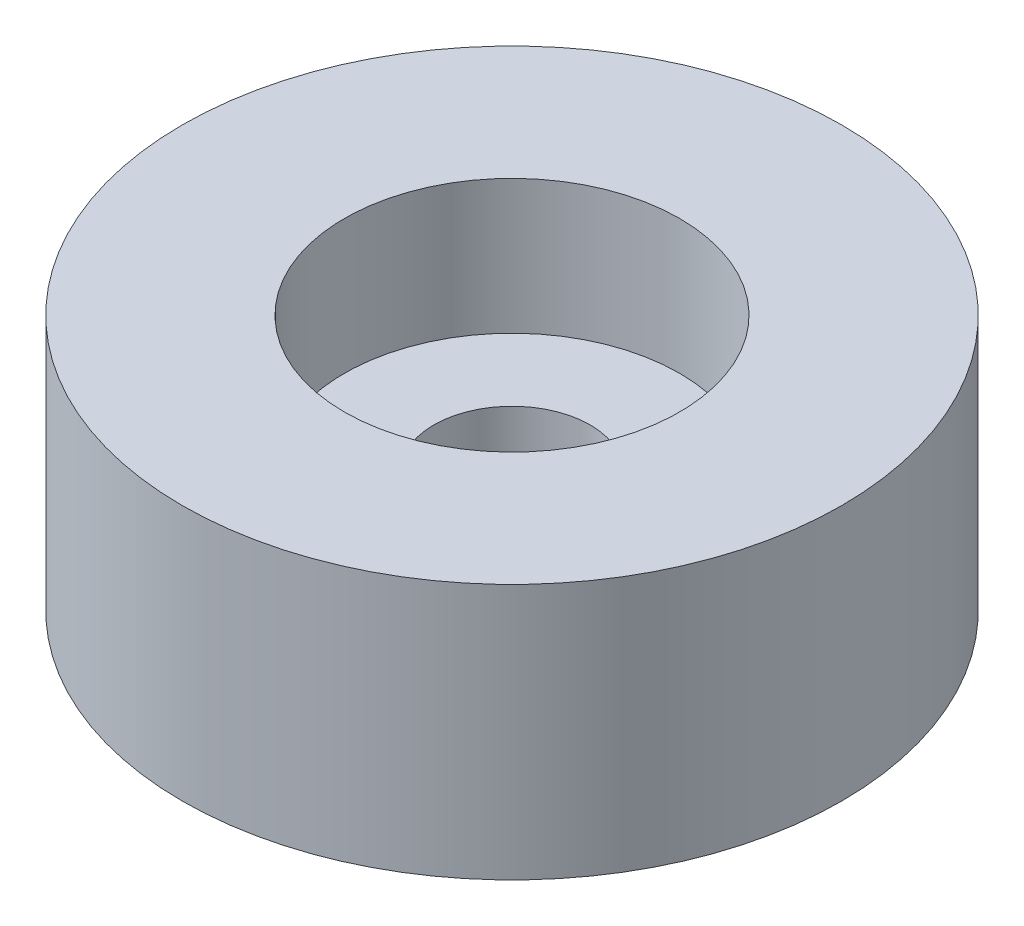
ISO-10303-21;
HEADER;
FILE_DESCRIPTION(('STEP AP214'),'2;1');
FILE_NAME('part.step','',(''),(''),'','','');
FILE_SCHEMA(('AUTOMOTIVE_DESIGN { 1 0 10303 214 1 1 1 1 }'));
ENDSEC;
DATA;
#1=APPLICATION_CONTEXT('core data for automotive mechanical design processes');
#2=APPLICATION_PROTOCOL_DEFINITION('international standard','automotive_design',2000,#1);
#3=PRODUCT_CONTEXT('',#1,'mechanical');
#4=PRODUCT('Part','Part','',(#3));
#5=PRODUCT_RELATED_PRODUCT_CATEGORY('part','',(#4));
#6=PRODUCT_DEFINITION_FORMATION('','',#4);
#7=PRODUCT_DEFINITION_CONTEXT('part definition',#1,'design');
#8=PRODUCT_DEFINITION('design','',#6,#7);
#9=PRODUCT_DEFINITION_SHAPE('','',#8);
#10=(LENGTH_UNIT() NAMED_UNIT(*) SI_UNIT(.MILLI.,.METRE.));
#11=(NAMED_UNIT(*) PLANE_ANGLE_UNIT() SI_UNIT($,.RADIAN.));
#12=(NAMED_UNIT(*) SI_UNIT($,.STERADIAN.) SOLID_ANGLE_UNIT());
#13=UNCERTAINTY_MEASURE_WITH_UNIT(LENGTH_MEASURE(1.E-05),#10,'distance_accuracy_value','');
#14=(GEOMETRIC_REPRESENTATION_CONTEXT(3) GLOBAL_UNCERTAINTY_ASSIGNED_CONTEXT((#13)) GLOBAL_UNIT_ASSIGNED_CONTEXT((#10,
#11,#12)) REPRESENTATION_CONTEXT('',''));
#15=CARTESIAN_POINT('',(0.,0.,0.));
#16=DIRECTION('',(0.,0.,1.));
#17=DIRECTION('',(1.,0.,0.));
#18=AXIS2_PLACEMENT_3D('',#15,#16,#17);
#19=CARTESIAN_POINT('',(0.,11.,0.));
#20=DIRECTION('',(0.,-1.,0.));
#21=DIRECTION('',(0.,0.,-1.));
#22=AXIS2_PLACEMENT_3D('',#19,#20,#21);
#23=CYLINDRICAL_SURFACE('',#22,7.);
#24=CARTESIAN_POINT('',(0.,3.,0.));
#25=DIRECTION('',(0.,-1.,0.));
#26=DIRECTION('',(0.,0.,-1.));
#27=AXIS2_PLACEMENT_3D('',#24,#25,#26);
#28=CIRCLE('',#27,7.);
#29=CARTESIAN_POINT('',(0.,3.,-7.));
#30=VERTEX_POINT('',#29);
#31=EDGE_CURVE('E137',#30,#30,#28,.T.);
#32=ORIENTED_EDGE('',*,*,#31,.T.);
#33=EDGE_LOOP('',(#32));
#34=FACE_BOUND('',#33,.T.);
#35=CARTESIAN_POINT('',(0.,10.9,0.));
#36=DIRECTION('',(0.,1.,0.));
#37=DIRECTION('',(0.,0.,1.));
#38=AXIS2_PLACEMENT_3D('',#35,#36,#37);
#39=CIRCLE('',#38,7.);
#40=CARTESIAN_POINT('',(0.,10.9,7.));
#41=VERTEX_POINT('',#40);
#42=EDGE_CURVE('E37',#41,#41,#39,.F.);
#43=ORIENTED_EDGE('',*,*,#42,.F.);
#44=EDGE_LOOP('',(#43));
#45=FACE_BOUND('',#44,.T.);
#46=ADVANCED_FACE('F33',(#34,#45),#23,.F.);
#47=CARTESIAN_POINT('',(0.,22.9,0.));
#48=DIRECTION('',(0.,-1.,0.));
#49=DIRECTION('',(0.,0.,-1.));
#50=AXIS2_PLACEMENT_3D('',#47,#48,#49);
#51=CYLINDRICAL_SURFACE('',#50,29.5);
#52=CARTESIAN_POINT('',(0.,22.9,0.));
#53=DIRECTION('',(0.,1.,0.));
#54=DIRECTION('',(0.,0.,1.));
#55=AXIS2_PLACEMENT_3D('',#52,#53,#54);
#56=CIRCLE('',#55,29.5);
#57=CARTESIAN_POINT('',(0.,22.9,29.5));
#58=VERTEX_POINT('',#57);
#59=EDGE_CURVE('E11',#58,#58,#56,.T.);
#60=ORIENTED_EDGE('',*,*,#59,.F.);
#61=EDGE_LOOP('',(#60));
#62=FACE_BOUND('',#61,.T.);
#63=CARTESIAN_POINT('',(0.,0.,0.));
#64=DIRECTION('',(0.,1.,0.));
#65=DIRECTION('',(0.,0.,1.));
#66=AXIS2_PLACEMENT_3D('',#63,#64,#65);
#67=CIRCLE('',#66,29.5);
#68=CARTESIAN_POINT('',(0.,0.,29.5));
#69=VERTEX_POINT('',#68);
#70=EDGE_CURVE('E42',#69,#69,#67,.T.);
#71=ORIENTED_EDGE('',*,*,#70,.T.);
#72=EDGE_LOOP('',(#71));
#73=FACE_BOUND('',#72,.T.);
#74=ADVANCED_FACE('F35',(#62,#73),#51,.T.);
#75=CARTESIAN_POINT('',(0.,22.9,0.));
#76=DIRECTION('',(0.,1.,0.));
#77=DIRECTION('',(0.,0.,1.));
#78=AXIS2_PLACEMENT_3D('',#75,#76,#77);
#79=PLANE('',#78);
#80=CARTESIAN_POINT('',(0.,22.9,0.));
#81=DIRECTION('',(0.,1.,0.));
#82=DIRECTION('',(0.,0.,1.));
#83=AXIS2_PLACEMENT_3D('',#80,#81,#82);
#84=CIRCLE('',#83,15.);
#85=CARTESIAN_POINT('',(0.,22.9,15.));
#86=VERTEX_POINT('',#85);
#87=EDGE_CURVE('E239',#86,#86,#84,.T.);
#88=ORIENTED_EDGE('',*,*,#87,.F.);
#89=EDGE_LOOP('',(#88));
#90=FACE_BOUND('',#89,.T.);
#91=ORIENTED_EDGE('',*,*,#59,.T.);
#92=EDGE_LOOP('',(#91));
#93=FACE_BOUND('',#92,.T.);
#94=ADVANCED_FACE('F171',(#90,#93),#79,.T.);
#95=CARTESIAN_POINT('',(0.,0.,0.));
#96=DIRECTION('',(0.,1.,0.));
#97=DIRECTION('',(0.,0.,1.));
#98=AXIS2_PLACEMENT_3D('',#95,#96,#97);
#99=PLANE('',#98);
#100=DIRECTION('',(-0.923879532511261,0.,0.382683432365151));
#101=VECTOR('',#100,1.);
#102=CARTESIAN_POINT('',(12.2458698356837,0.,12.245869835682));
#103=LINE('',#102,#101);
#104=CARTESIAN_POINT('',(12.2458698356837,0.,12.245869835682));
#105=VERTEX_POINT('',#104);
#106=CARTESIAN_POINT('',(1.15269990466416E-12,0.,17.3182752046782));
#107=VERTEX_POINT('',#106);
#108=EDGE_CURVE('E136',#105,#107,#103,.T.);
#109=ORIENTED_EDGE('',*,*,#108,.F.);
#110=DIRECTION('',(-0.382683432365028,0.,0.923879532511312));
#111=VECTOR('',#110,1.);
#112=CARTESIAN_POINT('',(17.3182752046782,0.,-1.15130762922161E-12));
#113=LINE('',#112,#111);
#114=CARTESIAN_POINT('',(17.3182752046782,0.,-1.15130762922161E-12));
#115=VERTEX_POINT('',#114);
#116=EDGE_CURVE('E50',#115,#105,#113,.T.);
#117=ORIENTED_EDGE('',*,*,#116,.F.);
#118=DIRECTION('',(0.382683432365151,0.,0.923879532511261));
#119=VECTOR('',#118,1.);
#120=CARTESIAN_POINT('',(12.245869835682,0.,-12.2458698356836));
#121=LINE('',#120,#119);
#122=CARTESIAN_POINT('',(12.245869835682,0.,-12.2458698356836));
#123=VERTEX_POINT('',#122);
#124=EDGE_CURVE('E152',#123,#115,#121,.T.);
#125=ORIENTED_EDGE('',*,*,#124,.F.);
#126=DIRECTION('',(0.923879532511312,0.,0.382683432365028));
#127=VECTOR('',#126,1.);
#128=CARTESIAN_POINT('',(-1.15558552231308E-12,0.,-17.3182752046782));
#129=LINE('',#128,#127);
#130=CARTESIAN_POINT('',(-1.15558552231308E-12,0.,-17.3182752046782));
#131=VERTEX_POINT('',#130);
#132=EDGE_CURVE('E150',#131,#123,#129,.T.);
#133=ORIENTED_EDGE('',*,*,#132,.F.);
#134=DIRECTION('',(0.923879532511261,0.,-0.382683432365151));
#135=VECTOR('',#134,1.);
#136=CARTESIAN_POINT('',(-12.2458698356836,0.,-12.245869835682));
#137=LINE('',#136,#135);
#138=CARTESIAN_POINT('',(-12.2458698356836,0.,-12.245869835682));
#139=VERTEX_POINT('',#138);
#140=EDGE_CURVE('E110',#139,#131,#137,.T.);
#141=ORIENTED_EDGE('',*,*,#140,.F.);
#142=DIRECTION('',(0.382683432365028,0.,-0.923879532511312));
#143=VECTOR('',#142,1.);
#144=CARTESIAN_POINT('',(-17.3182752046782,0.,1.14838694109665E-12));
#145=LINE('',#144,#143);
#146=CARTESIAN_POINT('',(-17.3182752046782,0.,1.14838694109665E-12));
#147=VERTEX_POINT('',#146);
#148=EDGE_CURVE('E146',#147,#139,#145,.T.);
#149=ORIENTED_EDGE('',*,*,#148,.F.);
#150=DIRECTION('',(-0.382683432365151,0.,-0.923879532511261));
#151=VECTOR('',#150,1.);
#152=CARTESIAN_POINT('',(-12.245869835682,0.,12.2458698356836));
#153=LINE('',#152,#151);
#154=CARTESIAN_POINT('',(-12.245869835682,0.,12.2458698356836));
#155=VERTEX_POINT('',#154);
#156=EDGE_CURVE('E143',#155,#147,#153,.T.);
#157=ORIENTED_EDGE('',*,*,#156,.F.);
#158=DIRECTION('',(-0.923879532511312,0.,-0.382683432365028));
#159=VECTOR('',#158,1.);
#160=CARTESIAN_POINT('',(1.15269990466416E-12,0.,17.3182752046782));
#161=LINE('',#160,#159);
#162=EDGE_CURVE('E140',#107,#155,#161,.T.);
#163=ORIENTED_EDGE('',*,*,#162,.F.);
#164=EDGE_LOOP('',(#109,#117,#125,#133,#141,#149,#157,#163));
#165=FACE_BOUND('',#164,.T.);
#166=ORIENTED_EDGE('',*,*,#70,.F.);
#167=EDGE_LOOP('',(#166));
#168=FACE_BOUND('',#167,.T.);
#169=ADVANCED_FACE('F168',(#165,#168),#99,.F.);
#170=CARTESIAN_POINT('',(17.3182752046782,3.,-1.15130762922161E-12));
#171=DIRECTION('',(0.923879532511312,0.,0.382683432365028));
#172=DIRECTION('',(0.382683432365028,0.,-0.923879532511312));
#173=AXIS2_PLACEMENT_3D('',#170,#171,#172);
#174=PLANE('',#173);
#175=ORIENTED_EDGE('',*,*,#116,.T.);
#176=DIRECTION('',(0.,-1.,0.));
#177=VECTOR('',#176,1.);
#178=CARTESIAN_POINT('',(12.2458698356837,3.,12.245869835682));
#179=LINE('',#178,#177);
#180=CARTESIAN_POINT('',(12.2458698356837,3.,12.245869835682));
#181=VERTEX_POINT('',#180);
#182=EDGE_CURVE('E86',#181,#105,#179,.T.);
#183=ORIENTED_EDGE('',*,*,#182,.F.);
#184=DIRECTION('',(-0.382683432365028,0.,0.923879532511312));
#185=VECTOR('',#184,1.);
#186=CARTESIAN_POINT('',(17.3182752046782,3.,-1.15130762922161E-12));
#187=LINE('',#186,#185);
#188=CARTESIAN_POINT('',(17.3182752046782,3.,-1.15130762922161E-12));
#189=VERTEX_POINT('',#188);
#190=EDGE_CURVE('E154',#189,#181,#187,.T.);
#191=ORIENTED_EDGE('',*,*,#190,.F.);
#192=DIRECTION('',(0.,-1.,0.));
#193=VECTOR('',#192,1.);
#194=CARTESIAN_POINT('',(17.3182752046782,3.,-1.15130762922161E-12));
#195=LINE('',#194,#193);
#196=EDGE_CURVE('E58',#189,#115,#195,.T.);
#197=ORIENTED_EDGE('',*,*,#196,.T.);
#198=EDGE_LOOP('',(#175,#183,#191,#197));
#199=FACE_BOUND('',#198,.T.);
#200=ADVANCED_FACE('F170',(#199),#174,.F.);
#201=CARTESIAN_POINT('',(12.245869835682,3.,-12.2458698356836));
#202=DIRECTION('',(0.923879532511261,0.,-0.382683432365151));
#203=DIRECTION('',(-0.382683432365151,0.,-0.923879532511261));
#204=AXIS2_PLACEMENT_3D('',#201,#202,#203);
#205=PLANE('',#204);
#206=ORIENTED_EDGE('',*,*,#124,.T.);
#207=ORIENTED_EDGE('',*,*,#196,.F.);
#208=DIRECTION('',(0.382683432365151,0.,0.923879532511261));
#209=VECTOR('',#208,1.);
#210=CARTESIAN_POINT('',(12.245869835682,3.,-12.2458698356836));
#211=LINE('',#210,#209);
#212=CARTESIAN_POINT('',(12.245869835682,3.,-12.2458698356836));
#213=VERTEX_POINT('',#212);
#214=EDGE_CURVE('E122',#213,#189,#211,.T.);
#215=ORIENTED_EDGE('',*,*,#214,.F.);
#216=DIRECTION('',(0.,-1.,0.));
#217=VECTOR('',#216,1.);
#218=CARTESIAN_POINT('',(12.245869835682,3.,-12.2458698356836));
#219=LINE('',#218,#217);
#220=EDGE_CURVE('E114',#213,#123,#219,.T.);
#221=ORIENTED_EDGE('',*,*,#220,.T.);
#222=EDGE_LOOP('',(#206,#207,#215,#221));
#223=FACE_BOUND('',#222,.T.);
#224=ADVANCED_FACE('F177',(#223),#205,.F.);
#225=CARTESIAN_POINT('',(-1.15558552231308E-12,3.,-17.3182752046782));
#226=DIRECTION('',(0.382683432365028,0.,-0.923879532511312));
#227=DIRECTION('',(-0.923879532511312,0.,-0.382683432365028));
#228=AXIS2_PLACEMENT_3D('',#225,#226,#227);
#229=PLANE('',#228);
#230=ORIENTED_EDGE('',*,*,#132,.T.);
#231=ORIENTED_EDGE('',*,*,#220,.F.);
#232=DIRECTION('',(0.923879532511312,0.,0.382683432365028));
#233=VECTOR('',#232,1.);
#234=CARTESIAN_POINT('',(-1.15558552231308E-12,3.,-17.3182752046782));
#235=LINE('',#234,#233);
#236=CARTESIAN_POINT('',(-1.15558552231308E-12,3.,-17.3182752046782));
#237=VERTEX_POINT('',#236);
#238=EDGE_CURVE('E118',#237,#213,#235,.T.);
#239=ORIENTED_EDGE('',*,*,#238,.F.);
#240=DIRECTION('',(0.,-1.,0.));
#241=VECTOR('',#240,1.);
#242=CARTESIAN_POINT('',(-1.15558552231308E-12,3.,-17.3182752046782));
#243=LINE('',#242,#241);
#244=EDGE_CURVE('E103',#237,#131,#243,.T.);
#245=ORIENTED_EDGE('',*,*,#244,.T.);
#246=EDGE_LOOP('',(#230,#231,#239,#245));
#247=FACE_BOUND('',#246,.T.);
#248=ADVANCED_FACE('F119',(#247),#229,.F.);
#249=CARTESIAN_POINT('',(-12.2458698356836,3.,-12.245869835682));
#250=DIRECTION('',(-0.382683432365151,0.,-0.923879532511261));
#251=DIRECTION('',(-0.923879532511261,0.,0.382683432365151));
#252=AXIS2_PLACEMENT_3D('',#249,#250,#251);
#253=PLANE('',#252);
#254=ORIENTED_EDGE('',*,*,#140,.T.);
#255=ORIENTED_EDGE('',*,*,#244,.F.);
#256=DIRECTION('',(0.923879532511261,0.,-0.382683432365151));
#257=VECTOR('',#256,1.);
#258=CARTESIAN_POINT('',(-12.2458698356836,3.,-12.245869835682));
#259=LINE('',#258,#257);
#260=CARTESIAN_POINT('',(-12.2458698356836,3.,-12.245869835682));
#261=VERTEX_POINT('',#260);
#262=EDGE_CURVE('E107',#261,#237,#259,.T.);
#263=ORIENTED_EDGE('',*,*,#262,.F.);
#264=DIRECTION('',(0.,-1.,0.));
#265=VECTOR('',#264,1.);
#266=CARTESIAN_POINT('',(-12.2458698356836,3.,-12.245869835682));
#267=LINE('',#266,#265);
#268=EDGE_CURVE('E115',#261,#139,#267,.T.);
#269=ORIENTED_EDGE('',*,*,#268,.T.);
#270=EDGE_LOOP('',(#254,#255,#263,#269));
#271=FACE_BOUND('',#270,.T.);
#272=ADVANCED_FACE('F105',(#271),#253,.F.);
#273=CARTESIAN_POINT('',(-17.3182752046782,3.,1.14838694109665E-12));
#274=DIRECTION('',(-0.923879532511312,0.,-0.382683432365028));
#275=DIRECTION('',(-0.382683432365028,0.,0.923879532511312));
#276=AXIS2_PLACEMENT_3D('',#273,#274,#275);
#277=PLANE('',#276);
#278=ORIENTED_EDGE('',*,*,#148,.T.);
#279=ORIENTED_EDGE('',*,*,#268,.F.);
#280=DIRECTION('',(0.382683432365028,0.,-0.923879532511312));
#281=VECTOR('',#280,1.);
#282=CARTESIAN_POINT('',(-17.3182752046782,3.,1.14838694109665E-12));
#283=LINE('',#282,#281);
#284=CARTESIAN_POINT('',(-17.3182752046782,3.,1.14838694109665E-12));
#285=VERTEX_POINT('',#284);
#286=EDGE_CURVE('E128',#285,#261,#283,.T.);
#287=ORIENTED_EDGE('',*,*,#286,.F.);
#288=DIRECTION('',(0.,-1.,0.));
#289=VECTOR('',#288,1.);
#290=CARTESIAN_POINT('',(-17.3182752046782,3.,1.14838694109665E-12));
#291=LINE('',#290,#289);
#292=EDGE_CURVE('E158',#285,#147,#291,.T.);
#293=ORIENTED_EDGE('',*,*,#292,.T.);
#294=EDGE_LOOP('',(#278,#279,#287,#293));
#295=FACE_BOUND('',#294,.T.);
#296=ADVANCED_FACE('F208',(#295),#277,.F.);
#297=CARTESIAN_POINT('',(-12.245869835682,3.,12.2458698356836));
#298=DIRECTION('',(-0.923879532511261,0.,0.382683432365151));
#299=DIRECTION('',(0.382683432365151,0.,0.923879532511261));
#300=AXIS2_PLACEMENT_3D('',#297,#298,#299);
#301=PLANE('',#300);
#302=ORIENTED_EDGE('',*,*,#156,.T.);
#303=ORIENTED_EDGE('',*,*,#292,.F.);
#304=DIRECTION('',(-0.382683432365151,0.,-0.923879532511261));
#305=VECTOR('',#304,1.);
#306=CARTESIAN_POINT('',(-12.245869835682,3.,12.2458698356836));
#307=LINE('',#306,#305);
#308=CARTESIAN_POINT('',(-12.245869835682,3.,12.2458698356836));
#309=VERTEX_POINT('',#308);
#310=EDGE_CURVE('E130',#309,#285,#307,.T.);
#311=ORIENTED_EDGE('',*,*,#310,.F.);
#312=DIRECTION('',(0.,-1.,0.));
#313=VECTOR('',#312,1.);
#314=CARTESIAN_POINT('',(-12.245869835682,3.,12.2458698356836));
#315=LINE('',#314,#313);
#316=EDGE_CURVE('E160',#309,#155,#315,.T.);
#317=ORIENTED_EDGE('',*,*,#316,.T.);
#318=EDGE_LOOP('',(#302,#303,#311,#317));
#319=FACE_BOUND('',#318,.T.);
#320=ADVANCED_FACE('F211',(#319),#301,.F.);
#321=CARTESIAN_POINT('',(1.15269990466416E-12,3.,17.3182752046782));
#322=DIRECTION('',(-0.382683432365028,0.,0.923879532511312));
#323=DIRECTION('',(0.923879532511312,0.,0.382683432365028));
#324=AXIS2_PLACEMENT_3D('',#321,#322,#323);
#325=PLANE('',#324);
#326=ORIENTED_EDGE('',*,*,#162,.T.);
#327=ORIENTED_EDGE('',*,*,#316,.F.);
#328=DIRECTION('',(-0.923879532511312,0.,-0.382683432365028));
#329=VECTOR('',#328,1.);
#330=CARTESIAN_POINT('',(1.15269990466416E-12,3.,17.3182752046782));
#331=LINE('',#330,#329);
#332=CARTESIAN_POINT('',(1.15269990466416E-12,3.,17.3182752046782));
#333=VERTEX_POINT('',#332);
#334=EDGE_CURVE('E230',#333,#309,#331,.T.);
#335=ORIENTED_EDGE('',*,*,#334,.F.);
#336=DIRECTION('',(0.,-1.,0.));
#337=VECTOR('',#336,1.);
#338=CARTESIAN_POINT('',(1.15269990466416E-12,3.,17.3182752046782));
#339=LINE('',#338,#337);
#340=EDGE_CURVE('E162',#333,#107,#339,.T.);
#341=ORIENTED_EDGE('',*,*,#340,.T.);
#342=EDGE_LOOP('',(#326,#327,#335,#341));
#343=FACE_BOUND('',#342,.T.);
#344=ADVANCED_FACE('F215',(#343),#325,.F.);
#345=CARTESIAN_POINT('',(12.2458698356837,3.,12.245869835682));
#346=DIRECTION('',(0.382683432365151,0.,0.923879532511261));
#347=DIRECTION('',(0.923879532511262,0.,-0.382683432365151));
#348=AXIS2_PLACEMENT_3D('',#345,#346,#347);
#349=PLANE('',#348);
#350=ORIENTED_EDGE('',*,*,#108,.T.);
#351=ORIENTED_EDGE('',*,*,#340,.F.);
#352=DIRECTION('',(-0.923879532511261,0.,0.382683432365151));
#353=VECTOR('',#352,1.);
#354=CARTESIAN_POINT('',(12.2458698356837,3.,12.245869835682));
#355=LINE('',#354,#353);
#356=EDGE_CURVE('E232',#181,#333,#355,.T.);
#357=ORIENTED_EDGE('',*,*,#356,.F.);
#358=ORIENTED_EDGE('',*,*,#182,.T.);
#359=EDGE_LOOP('',(#350,#351,#357,#358));
#360=FACE_BOUND('',#359,.T.);
#361=ADVANCED_FACE('F200',(#360),#349,.F.);
#362=CARTESIAN_POINT('',(0.,3.,0.));
#363=DIRECTION('',(0.,-1.,0.));
#364=DIRECTION('',(0.,0.,-1.));
#365=AXIS2_PLACEMENT_3D('',#362,#363,#364);
#366=PLANE('',#365);
#367=ORIENTED_EDGE('',*,*,#31,.F.);
#368=EDGE_LOOP('',(#367));
#369=FACE_BOUND('',#368,.T.);
#370=ORIENTED_EDGE('',*,*,#190,.T.);
#371=ORIENTED_EDGE('',*,*,#356,.T.);
#372=ORIENTED_EDGE('',*,*,#334,.T.);
#373=ORIENTED_EDGE('',*,*,#310,.T.);
#374=ORIENTED_EDGE('',*,*,#286,.T.);
#375=ORIENTED_EDGE('',*,*,#262,.T.);
#376=ORIENTED_EDGE('',*,*,#238,.T.);
#377=ORIENTED_EDGE('',*,*,#214,.T.);
#378=EDGE_LOOP('',(#370,#371,#372,#373,#374,#375,#376,#377));
#379=FACE_BOUND('',#378,.T.);
#380=ADVANCED_FACE('F125',(#369,#379),#366,.T.);
#381=CARTESIAN_POINT('',(0.,10.9,0.));
#382=DIRECTION('',(0.,1.,0.));
#383=DIRECTION('',(0.,0.,1.));
#384=AXIS2_PLACEMENT_3D('',#381,#382,#383);
#385=PLANE('',#384);
#386=CARTESIAN_POINT('',(0.,10.9,0.));
#387=DIRECTION('',(0.,1.,0.));
#388=DIRECTION('',(0.,0.,1.));
#389=AXIS2_PLACEMENT_3D('',#386,#387,#388);
#390=CIRCLE('',#389,15.);
#391=CARTESIAN_POINT('',(0.,10.9,15.));
#392=VERTEX_POINT('',#391);
#393=EDGE_CURVE('E242',#392,#392,#390,.T.);
#394=ORIENTED_EDGE('',*,*,#393,.T.);
#395=EDGE_LOOP('',(#394));
#396=FACE_BOUND('',#395,.T.);
#397=ORIENTED_EDGE('',*,*,#42,.T.);
#398=EDGE_LOOP('',(#397));
#399=FACE_BOUND('',#398,.T.);
#400=ADVANCED_FACE('F199',(#396,#399),#385,.T.);
#401=CARTESIAN_POINT('',(0.,10.9,0.));
#402=DIRECTION('',(0.,1.,0.));
#403=DIRECTION('',(0.,0.,1.));
#404=AXIS2_PLACEMENT_3D('',#401,#402,#403);
#405=CYLINDRICAL_SURFACE('',#404,15.);
#406=ORIENTED_EDGE('',*,*,#393,.F.);
#407=EDGE_LOOP('',(#406));
#408=FACE_BOUND('',#407,.T.);
#409=ORIENTED_EDGE('',*,*,#87,.T.);
#410=EDGE_LOOP('',(#409));
#411=FACE_BOUND('',#410,.T.);
#412=ADVANCED_FACE('F195',(#408,#411),#405,.F.);
#413=CLOSED_SHELL('',(#46,#74,#94,#169,#200,#224,#248,#272,#296,#320,#344,#361,#380,#400,#412));
#414=MANIFOLD_SOLID_BREP('B2',#413);
#415=ADVANCED_BREP_SHAPE_REPRESENTATION('',(#18,#414),#14);
#416=SHAPE_DEFINITION_REPRESENTATION(#9,#415);
ENDSEC;
END-ISO-10303-21;
